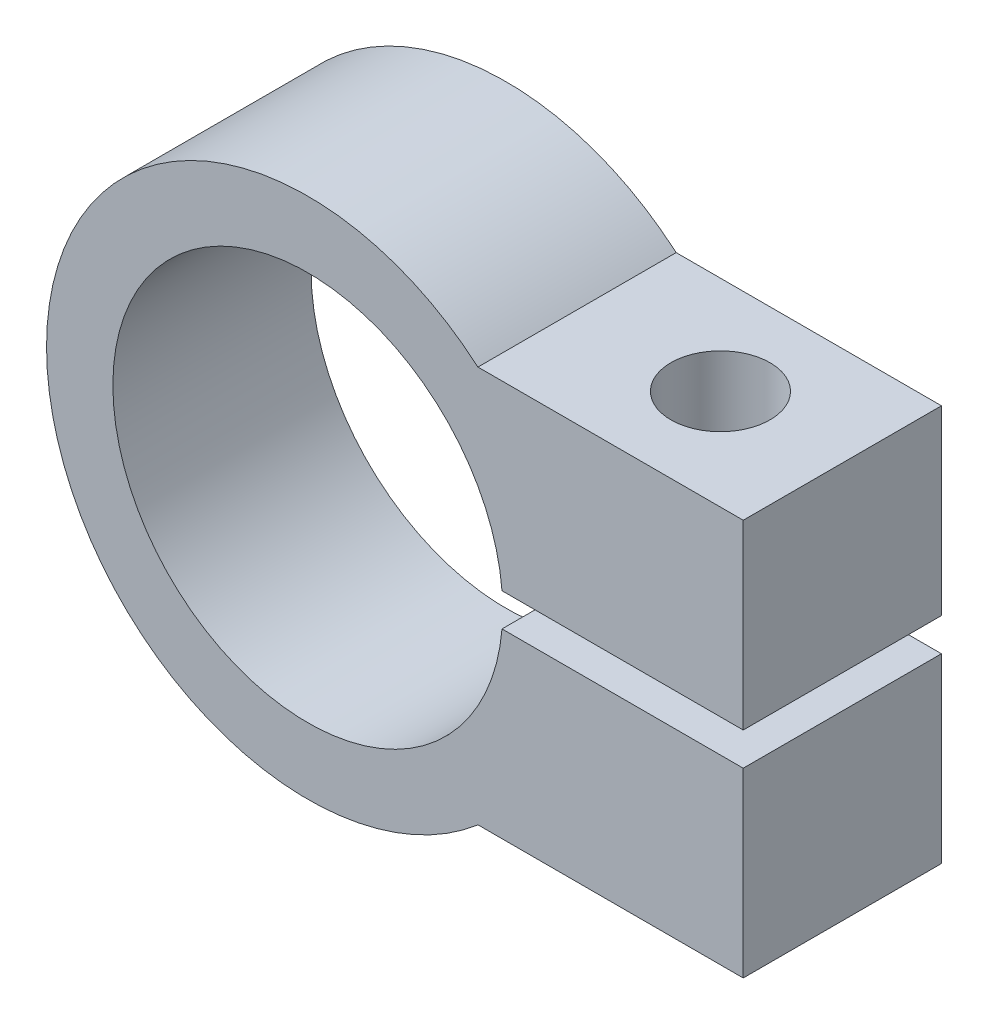
ISO-10303-21;
HEADER;
FILE_DESCRIPTION(('STEP AP214'),'2;1');
FILE_NAME('part.step','',(''),(''),'','','');
FILE_SCHEMA(('AUTOMOTIVE_DESIGN { 1 0 10303 214 1 1 1 1 }'));
ENDSEC;
DATA;
#1=APPLICATION_CONTEXT('core data for automotive mechanical design processes');
#2=APPLICATION_PROTOCOL_DEFINITION('international standard','automotive_design',2000,#1);
#3=PRODUCT_CONTEXT('',#1,'mechanical');
#4=PRODUCT('Part','Part','',(#3));
#5=PRODUCT_RELATED_PRODUCT_CATEGORY('part','',(#4));
#6=PRODUCT_DEFINITION_FORMATION('','',#4);
#7=PRODUCT_DEFINITION_CONTEXT('part definition',#1,'design');
#8=PRODUCT_DEFINITION('design','',#6,#7);
#9=PRODUCT_DEFINITION_SHAPE('','',#8);
#10=(LENGTH_UNIT() NAMED_UNIT(*) SI_UNIT(.MILLI.,.METRE.));
#11=(NAMED_UNIT(*) PLANE_ANGLE_UNIT() SI_UNIT($,.RADIAN.));
#12=(NAMED_UNIT(*) SI_UNIT($,.STERADIAN.) SOLID_ANGLE_UNIT());
#13=UNCERTAINTY_MEASURE_WITH_UNIT(LENGTH_MEASURE(1.E-05),#10,'distance_accuracy_value','');
#14=(GEOMETRIC_REPRESENTATION_CONTEXT(3) GLOBAL_UNCERTAINTY_ASSIGNED_CONTEXT((#13)) GLOBAL_UNIT_ASSIGNED_CONTEXT((#10,
#11,#12)) REPRESENTATION_CONTEXT('',''));
#15=CARTESIAN_POINT('',(0.,0.,0.));
#16=DIRECTION('',(0.,0.,1.));
#17=DIRECTION('',(1.,0.,0.));
#18=AXIS2_PLACEMENT_3D('',#15,#16,#17);
#19=CARTESIAN_POINT('',(-46.0029624734615,49.2532074689043,6.));
#20=DIRECTION('',(0.,0.,-1.));
#21=DIRECTION('',(-1.,0.,0.));
#22=AXIS2_PLACEMENT_3D('',#19,#20,#21);
#23=CYLINDRICAL_SURFACE('',#22,5.9);
#24=CARTESIAN_POINT('',(-46.0029624734615,49.2532074689043,0.));
#25=DIRECTION('',(0.,0.,1.));
#26=DIRECTION('',(1.,0.,0.));
#27=AXIS2_PLACEMENT_3D('',#24,#25,#26);
#28=CIRCLE('',#27,5.9);
#29=CARTESIAN_POINT('',(-40.1241870907819,49.7532074689043,0.));
#30=VERTEX_POINT('',#29);
#31=CARTESIAN_POINT('',(-40.1241870907819,48.7532074689043,0.));
#32=VERTEX_POINT('',#31);
#33=EDGE_CURVE('E127',#30,#32,#28,.T.);
#34=ORIENTED_EDGE('',*,*,#33,.F.);
#35=DIRECTION('',(0.,0.,-1.));
#36=VECTOR('',#35,1.);
#37=CARTESIAN_POINT('',(-40.1241870907819,49.7532074689043,6.));
#38=LINE('',#37,#36);
#39=CARTESIAN_POINT('',(-40.1241870907819,49.7532074689043,6.));
#40=VERTEX_POINT('',#39);
#41=EDGE_CURVE('E11',#40,#30,#38,.T.);
#42=ORIENTED_EDGE('',*,*,#41,.F.);
#43=CARTESIAN_POINT('',(-46.0029624734615,49.2532074689043,6.));
#44=DIRECTION('',(0.,0.,1.));
#45=DIRECTION('',(1.,0.,0.));
#46=AXIS2_PLACEMENT_3D('',#43,#44,#45);
#47=CIRCLE('',#46,5.9);
#48=CARTESIAN_POINT('',(-40.1241870907819,48.7532074689043,6.));
#49=VERTEX_POINT('',#48);
#50=EDGE_CURVE('E146',#40,#49,#47,.T.);
#51=ORIENTED_EDGE('',*,*,#50,.T.);
#52=DIRECTION('',(0.,0.,-1.));
#53=VECTOR('',#52,1.);
#54=CARTESIAN_POINT('',(-40.1241870907819,48.7532074689043,6.));
#55=LINE('',#54,#53);
#56=EDGE_CURVE('E85',#49,#32,#55,.T.);
#57=ORIENTED_EDGE('',*,*,#56,.T.);
#58=EDGE_LOOP('',(#34,#42,#51,#57));
#59=FACE_BOUND('',#58,.T.);
#60=ADVANCED_FACE('F33',(#59),#23,.F.);
#61=CARTESIAN_POINT('',(0.,49.7532074689043,6.));
#62=DIRECTION('',(0.,-1.,0.));
#63=DIRECTION('',(1.,0.,0.));
#64=AXIS2_PLACEMENT_3D('',#61,#62,#63);
#65=PLANE('',#64);
#66=CARTESIAN_POINT('',(-36.5474517280928,49.7532074689043,2.96481335010715));
#67=DIRECTION('',(0.,-1.,0.));
#68=DIRECTION('',(1.,0.,0.));
#69=AXIS2_PLACEMENT_3D('',#66,#67,#68);
#70=CIRCLE('',#69,1.5);
#71=CARTESIAN_POINT('',(-35.0474517280928,49.7532074689043,2.96481335010715));
#72=VERTEX_POINT('',#71);
#73=EDGE_CURVE('E131',#72,#72,#70,.T.);
#74=ORIENTED_EDGE('',*,*,#73,.F.);
#75=EDGE_LOOP('',(#74));
#76=FACE_BOUND('',#75,.T.);
#77=DIRECTION('',(-1.,0.,0.));
#78=VECTOR('',#77,1.);
#79=CARTESIAN_POINT('',(0.,49.7532074689043,0.));
#80=LINE('',#79,#78);
#81=CARTESIAN_POINT('',(-32.8228460920789,49.7532074689043,0.));
#82=VERTEX_POINT('',#81);
#83=EDGE_CURVE('E130',#82,#30,#80,.T.);
#84=ORIENTED_EDGE('',*,*,#83,.F.);
#85=DIRECTION('',(0.,0.,-1.));
#86=VECTOR('',#85,1.);
#87=CARTESIAN_POINT('',(-32.8228460920789,49.7532074689043,6.));
#88=LINE('',#87,#86);
#89=CARTESIAN_POINT('',(-32.8228460920789,49.7532074689043,6.));
#90=VERTEX_POINT('',#89);
#91=EDGE_CURVE('E42',#90,#82,#88,.T.);
#92=ORIENTED_EDGE('',*,*,#91,.F.);
#93=DIRECTION('',(-1.,0.,0.));
#94=VECTOR('',#93,1.);
#95=CARTESIAN_POINT('',(0.,49.7532074689043,6.));
#96=LINE('',#95,#94);
#97=EDGE_CURVE('E173',#90,#40,#96,.T.);
#98=ORIENTED_EDGE('',*,*,#97,.T.);
#99=ORIENTED_EDGE('',*,*,#41,.T.);
#100=EDGE_LOOP('',(#84,#92,#98,#99));
#101=FACE_BOUND('',#100,.T.);
#102=ADVANCED_FACE('F164',(#76,#101),#65,.T.);
#103=CARTESIAN_POINT('',(-32.8228460920789,0.,6.));
#104=DIRECTION('',(1.,0.,0.));
#105=DIRECTION('',(0.,0.,-1.));
#106=AXIS2_PLACEMENT_3D('',#103,#104,#105);
#107=PLANE('',#106);
#108=DIRECTION('',(0.,-1.,0.));
#109=VECTOR('',#108,1.);
#110=CARTESIAN_POINT('',(-32.8228460920789,0.,0.));
#111=LINE('',#110,#109);
#112=CARTESIAN_POINT('',(-32.8228460920789,55.2532074689043,0.));
#113=VERTEX_POINT('',#112);
#114=EDGE_CURVE('E134',#113,#82,#111,.T.);
#115=ORIENTED_EDGE('',*,*,#114,.F.);
#116=DIRECTION('',(0.,0.,-1.));
#117=VECTOR('',#116,1.);
#118=CARTESIAN_POINT('',(-32.8228460920789,55.2532074689043,6.));
#119=LINE('',#118,#117);
#120=CARTESIAN_POINT('',(-32.8228460920789,55.2532074689043,6.));
#121=VERTEX_POINT('',#120);
#122=EDGE_CURVE('E152',#121,#113,#119,.T.);
#123=ORIENTED_EDGE('',*,*,#122,.F.);
#124=DIRECTION('',(0.,-1.,0.));
#125=VECTOR('',#124,1.);
#126=CARTESIAN_POINT('',(-32.8228460920789,0.,6.));
#127=LINE('',#126,#125);
#128=EDGE_CURVE('E160',#121,#90,#127,.T.);
#129=ORIENTED_EDGE('',*,*,#128,.T.);
#130=ORIENTED_EDGE('',*,*,#91,.T.);
#131=EDGE_LOOP('',(#115,#123,#129,#130));
#132=FACE_BOUND('',#131,.T.);
#133=ADVANCED_FACE('F158',(#132),#107,.T.);
#134=CARTESIAN_POINT('',(0.,55.2532074689043,6.));
#135=DIRECTION('',(0.,1.,0.));
#136=DIRECTION('',(-1.,0.,0.));
#137=AXIS2_PLACEMENT_3D('',#134,#135,#136);
#138=PLANE('',#137);
#139=CARTESIAN_POINT('',(-36.5474517280928,55.2532074689043,2.96481335010715));
#140=DIRECTION('',(0.,1.,0.));
#141=DIRECTION('',(-1.,0.,0.));
#142=AXIS2_PLACEMENT_3D('',#139,#140,#141);
#143=CIRCLE('',#142,1.5);
#144=CARTESIAN_POINT('',(-38.0474517280928,55.2532074689043,2.96481335010715));
#145=VERTEX_POINT('',#144);
#146=EDGE_CURVE('E184',#145,#145,#143,.T.);
#147=ORIENTED_EDGE('',*,*,#146,.F.);
#148=EDGE_LOOP('',(#147));
#149=FACE_BOUND('',#148,.T.);
#150=DIRECTION('',(1.,0.,0.));
#151=VECTOR('',#150,1.);
#152=CARTESIAN_POINT('',(0.,55.2532074689043,0.));
#153=LINE('',#152,#151);
#154=CARTESIAN_POINT('',(-40.8524660403866,55.2532074689043,0.));
#155=VERTEX_POINT('',#154);
#156=EDGE_CURVE('E137',#155,#113,#153,.T.);
#157=ORIENTED_EDGE('',*,*,#156,.F.);
#158=DIRECTION('',(0.,0.,-1.));
#159=VECTOR('',#158,1.);
#160=CARTESIAN_POINT('',(-40.8524660403866,55.2532074689043,6.));
#161=LINE('',#160,#159);
#162=CARTESIAN_POINT('',(-40.8524660403866,55.2532074689043,6.));
#163=VERTEX_POINT('',#162);
#164=EDGE_CURVE('E150',#163,#155,#161,.T.);
#165=ORIENTED_EDGE('',*,*,#164,.F.);
#166=DIRECTION('',(1.,0.,0.));
#167=VECTOR('',#166,1.);
#168=CARTESIAN_POINT('',(0.,55.2532074689043,6.));
#169=LINE('',#168,#167);
#170=EDGE_CURVE('E172',#163,#121,#169,.T.);
#171=ORIENTED_EDGE('',*,*,#170,.T.);
#172=ORIENTED_EDGE('',*,*,#122,.T.);
#173=EDGE_LOOP('',(#157,#165,#171,#172));
#174=FACE_BOUND('',#173,.T.);
#175=ADVANCED_FACE('F170',(#149,#174),#138,.T.);
#176=CARTESIAN_POINT('',(-46.0029624734615,49.2532074689043,6.));
#177=DIRECTION('',(0.,0.,-1.));
#178=DIRECTION('',(-1.,0.,0.));
#179=AXIS2_PLACEMENT_3D('',#176,#177,#178);
#180=CYLINDRICAL_SURFACE('',#179,7.90744038909672);
#181=CARTESIAN_POINT('',(-46.0029624734615,49.2532074689043,0.));
#182=DIRECTION('',(0.,0.,1.));
#183=DIRECTION('',(1.,0.,0.));
#184=AXIS2_PLACEMENT_3D('',#181,#182,#183);
#185=CIRCLE('',#184,7.90744038909672);
#186=CARTESIAN_POINT('',(-40.8524660403866,43.2532074689043,0.));
#187=VERTEX_POINT('',#186);
#188=EDGE_CURVE('E140',#155,#187,#185,.T.);
#189=ORIENTED_EDGE('',*,*,#188,.T.);
#190=DIRECTION('',(0.,0.,-1.));
#191=VECTOR('',#190,1.);
#192=CARTESIAN_POINT('',(-40.8524660403866,43.2532074689043,6.));
#193=LINE('',#192,#191);
#194=CARTESIAN_POINT('',(-40.8524660403866,43.2532074689043,6.));
#195=VERTEX_POINT('',#194);
#196=EDGE_CURVE('E119',#195,#187,#193,.T.);
#197=ORIENTED_EDGE('',*,*,#196,.F.);
#198=CARTESIAN_POINT('',(-46.0029624734615,49.2532074689043,6.));
#199=DIRECTION('',(0.,0.,1.));
#200=DIRECTION('',(1.,0.,0.));
#201=AXIS2_PLACEMENT_3D('',#198,#199,#200);
#202=CIRCLE('',#201,7.90744038909672);
#203=EDGE_CURVE('E110',#163,#195,#202,.T.);
#204=ORIENTED_EDGE('',*,*,#203,.F.);
#205=ORIENTED_EDGE('',*,*,#164,.T.);
#206=EDGE_LOOP('',(#189,#197,#204,#205));
#207=FACE_BOUND('',#206,.T.);
#208=ADVANCED_FACE('F202',(#207),#180,.T.);
#209=CARTESIAN_POINT('',(0.,43.2532074689044,6.));
#210=DIRECTION('',(0.,1.,0.));
#211=DIRECTION('',(-1.,0.,0.));
#212=AXIS2_PLACEMENT_3D('',#209,#210,#211);
#213=PLANE('',#212);
#214=CARTESIAN_POINT('',(-36.5474517280929,43.2532074689043,2.96481335010715));
#215=DIRECTION('',(0.,1.,0.));
#216=DIRECTION('',(-1.,0.,0.));
#217=AXIS2_PLACEMENT_3D('',#214,#215,#216);
#218=CIRCLE('',#217,1.5);
#219=CARTESIAN_POINT('',(-38.0474517280929,43.2532074689043,2.96481335010715));
#220=VERTEX_POINT('',#219);
#221=EDGE_CURVE('E181',#220,#220,#218,.T.);
#222=ORIENTED_EDGE('',*,*,#221,.T.);
#223=EDGE_LOOP('',(#222));
#224=FACE_BOUND('',#223,.T.);
#225=DIRECTION('',(1.,0.,0.));
#226=VECTOR('',#225,1.);
#227=CARTESIAN_POINT('',(0.,43.2532074689044,0.));
#228=LINE('',#227,#226);
#229=CARTESIAN_POINT('',(-32.8228460920789,43.2532074689043,0.));
#230=VERTEX_POINT('',#229);
#231=EDGE_CURVE('E118',#187,#230,#228,.T.);
#232=ORIENTED_EDGE('',*,*,#231,.T.);
#233=DIRECTION('',(0.,0.,-1.));
#234=VECTOR('',#233,1.);
#235=CARTESIAN_POINT('',(-32.8228460920789,43.2532074689043,6.));
#236=LINE('',#235,#234);
#237=CARTESIAN_POINT('',(-32.8228460920789,43.2532074689043,6.));
#238=VERTEX_POINT('',#237);
#239=EDGE_CURVE('E115',#238,#230,#236,.T.);
#240=ORIENTED_EDGE('',*,*,#239,.F.);
#241=DIRECTION('',(1.,0.,0.));
#242=VECTOR('',#241,1.);
#243=CARTESIAN_POINT('',(0.,43.2532074689044,6.));
#244=LINE('',#243,#242);
#245=EDGE_CURVE('E103',#195,#238,#244,.T.);
#246=ORIENTED_EDGE('',*,*,#245,.F.);
#247=ORIENTED_EDGE('',*,*,#196,.T.);
#248=EDGE_LOOP('',(#232,#240,#246,#247));
#249=FACE_BOUND('',#248,.T.);
#250=ADVANCED_FACE('F116',(#224,#249),#213,.F.);
#251=CARTESIAN_POINT('',(-32.8228460920789,0.,6.));
#252=DIRECTION('',(-1.,0.,0.));
#253=DIRECTION('',(0.,0.,1.));
#254=AXIS2_PLACEMENT_3D('',#251,#252,#253);
#255=PLANE('',#254);
#256=DIRECTION('',(0.,1.,0.));
#257=VECTOR('',#256,1.);
#258=CARTESIAN_POINT('',(-32.8228460920789,0.,0.));
#259=LINE('',#258,#257);
#260=CARTESIAN_POINT('',(-32.8228460920789,48.7532074689043,0.));
#261=VERTEX_POINT('',#260);
#262=EDGE_CURVE('E78',#230,#261,#259,.T.);
#263=ORIENTED_EDGE('',*,*,#262,.T.);
#264=DIRECTION('',(0.,0.,-1.));
#265=VECTOR('',#264,1.);
#266=CARTESIAN_POINT('',(-32.8228460920789,48.7532074689043,6.));
#267=LINE('',#266,#265);
#268=CARTESIAN_POINT('',(-32.8228460920789,48.7532074689043,6.));
#269=VERTEX_POINT('',#268);
#270=EDGE_CURVE('E120',#269,#261,#267,.T.);
#271=ORIENTED_EDGE('',*,*,#270,.F.);
#272=DIRECTION('',(0.,1.,0.));
#273=VECTOR('',#272,1.);
#274=CARTESIAN_POINT('',(-32.8228460920789,0.,6.));
#275=LINE('',#274,#273);
#276=EDGE_CURVE('E107',#238,#269,#275,.T.);
#277=ORIENTED_EDGE('',*,*,#276,.F.);
#278=ORIENTED_EDGE('',*,*,#239,.T.);
#279=EDGE_LOOP('',(#263,#271,#277,#278));
#280=FACE_BOUND('',#279,.T.);
#281=ADVANCED_FACE('F122',(#280),#255,.F.);
#282=CARTESIAN_POINT('',(0.,48.7532074689043,6.));
#283=DIRECTION('',(0.,-1.,0.));
#284=DIRECTION('',(1.,0.,0.));
#285=AXIS2_PLACEMENT_3D('',#282,#283,#284);
#286=PLANE('',#285);
#287=CARTESIAN_POINT('',(-36.5474517280928,48.7532074689043,2.96481335010715));
#288=DIRECTION('',(0.,-1.,0.));
#289=DIRECTION('',(1.,0.,0.));
#290=AXIS2_PLACEMENT_3D('',#287,#288,#289);
#291=CIRCLE('',#290,1.5);
#292=CARTESIAN_POINT('',(-35.0474517280928,48.7532074689043,2.96481335010715));
#293=VERTEX_POINT('',#292);
#294=EDGE_CURVE('E36',#293,#293,#291,.T.);
#295=ORIENTED_EDGE('',*,*,#294,.T.);
#296=EDGE_LOOP('',(#295));
#297=FACE_BOUND('',#296,.T.);
#298=DIRECTION('',(-1.,0.,0.));
#299=VECTOR('',#298,1.);
#300=CARTESIAN_POINT('',(0.,48.7532074689043,0.));
#301=LINE('',#300,#299);
#302=EDGE_CURVE('E144',#261,#32,#301,.T.);
#303=ORIENTED_EDGE('',*,*,#302,.T.);
#304=ORIENTED_EDGE('',*,*,#56,.F.);
#305=DIRECTION('',(-1.,0.,0.));
#306=VECTOR('',#305,1.);
#307=CARTESIAN_POINT('',(0.,48.7532074689043,6.));
#308=LINE('',#307,#306);
#309=EDGE_CURVE('E50',#269,#49,#308,.T.);
#310=ORIENTED_EDGE('',*,*,#309,.F.);
#311=ORIENTED_EDGE('',*,*,#270,.T.);
#312=EDGE_LOOP('',(#303,#304,#310,#311));
#313=FACE_BOUND('',#312,.T.);
#314=ADVANCED_FACE('F191',(#297,#313),#286,.F.);
#315=CARTESIAN_POINT('',(0.,0.,6.));
#316=DIRECTION('',(0.,0.,1.));
#317=DIRECTION('',(1.,0.,0.));
#318=AXIS2_PLACEMENT_3D('',#315,#316,#317);
#319=PLANE('',#318);
#320=ORIENTED_EDGE('',*,*,#50,.F.);
#321=ORIENTED_EDGE('',*,*,#97,.F.);
#322=ORIENTED_EDGE('',*,*,#128,.F.);
#323=ORIENTED_EDGE('',*,*,#170,.F.);
#324=ORIENTED_EDGE('',*,*,#203,.T.);
#325=ORIENTED_EDGE('',*,*,#245,.T.);
#326=ORIENTED_EDGE('',*,*,#276,.T.);
#327=ORIENTED_EDGE('',*,*,#309,.T.);
#328=EDGE_LOOP('',(#320,#321,#322,#323,#324,#325,#326,#327));
#329=FACE_BOUND('',#328,.T.);
#330=ADVANCED_FACE('F105',(#329),#319,.T.);
#331=CARTESIAN_POINT('',(0.,0.,0.));
#332=DIRECTION('',(0.,0.,1.));
#333=DIRECTION('',(1.,0.,0.));
#334=AXIS2_PLACEMENT_3D('',#331,#332,#333);
#335=PLANE('',#334);
#336=ORIENTED_EDGE('',*,*,#33,.T.);
#337=ORIENTED_EDGE('',*,*,#302,.F.);
#338=ORIENTED_EDGE('',*,*,#262,.F.);
#339=ORIENTED_EDGE('',*,*,#231,.F.);
#340=ORIENTED_EDGE('',*,*,#188,.F.);
#341=ORIENTED_EDGE('',*,*,#156,.T.);
#342=ORIENTED_EDGE('',*,*,#114,.T.);
#343=ORIENTED_EDGE('',*,*,#83,.T.);
#344=EDGE_LOOP('',(#336,#337,#338,#339,#340,#341,#342,#343));
#345=FACE_BOUND('',#344,.T.);
#346=ADVANCED_FACE('F166',(#345),#335,.F.);
#347=CARTESIAN_POINT('',(-36.5474517280929,41.2532074689043,2.96481335010715));
#348=DIRECTION('',(0.,1.,0.));
#349=DIRECTION('',(-1.,0.,0.));
#350=AXIS2_PLACEMENT_3D('',#347,#348,#349);
#351=CYLINDRICAL_SURFACE('',#350,1.5);
#352=ORIENTED_EDGE('',*,*,#294,.F.);
#353=EDGE_LOOP('',(#352));
#354=FACE_BOUND('',#353,.T.);
#355=ORIENTED_EDGE('',*,*,#221,.F.);
#356=EDGE_LOOP('',(#355));
#357=FACE_BOUND('',#356,.T.);
#358=ADVANCED_FACE('F194',(#354,#357),#351,.F.);
#359=ORIENTED_EDGE('',*,*,#73,.T.);
#360=EDGE_LOOP('',(#359));
#361=FACE_BOUND('',#360,.T.);
#362=ORIENTED_EDGE('',*,*,#146,.T.);
#363=EDGE_LOOP('',(#362));
#364=FACE_BOUND('',#363,.T.);
#365=ADVANCED_FACE('F197',(#361,#364),#351,.F.);
#366=CLOSED_SHELL('',(#60,#102,#133,#175,#208,#250,#281,#314,#330,#346,#358,#365));
#367=MANIFOLD_SOLID_BREP('B2',#366);
#368=ADVANCED_BREP_SHAPE_REPRESENTATION('',(#18,#367),#14);
#369=SHAPE_DEFINITION_REPRESENTATION(#9,#368);
ENDSEC;
END-ISO-10303-21;
